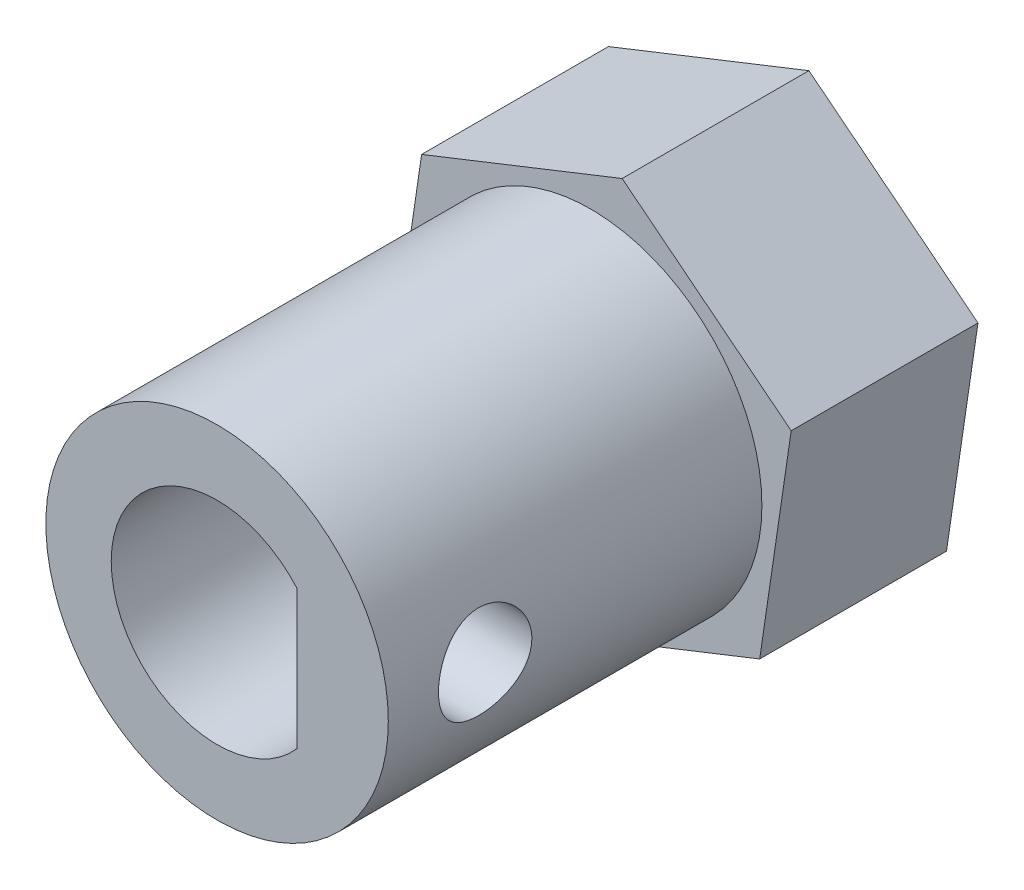
ISO-10303-21;
HEADER;
FILE_DESCRIPTION(('STEP AP214'),'2;1');
FILE_NAME('part.step','',(''),(''),'','','');
FILE_SCHEMA(('AUTOMOTIVE_DESIGN { 1 0 10303 214 1 1 1 1 }'));
ENDSEC;
DATA;
#1=APPLICATION_CONTEXT('core data for automotive mechanical design processes');
#2=APPLICATION_PROTOCOL_DEFINITION('international standard','automotive_design',2000,#1);
#3=PRODUCT_CONTEXT('',#1,'mechanical');
#4=PRODUCT('Part','Part','',(#3));
#5=PRODUCT_RELATED_PRODUCT_CATEGORY('part','',(#4));
#6=PRODUCT_DEFINITION_FORMATION('','',#4);
#7=PRODUCT_DEFINITION_CONTEXT('part definition',#1,'design');
#8=PRODUCT_DEFINITION('design','',#6,#7);
#9=PRODUCT_DEFINITION_SHAPE('','',#8);
#10=(LENGTH_UNIT() NAMED_UNIT(*) SI_UNIT(.MILLI.,.METRE.));
#11=(NAMED_UNIT(*) PLANE_ANGLE_UNIT() SI_UNIT($,.RADIAN.));
#12=(NAMED_UNIT(*) SI_UNIT($,.STERADIAN.) SOLID_ANGLE_UNIT());
#13=UNCERTAINTY_MEASURE_WITH_UNIT(LENGTH_MEASURE(1.E-05),#10,'distance_accuracy_value','');
#14=(GEOMETRIC_REPRESENTATION_CONTEXT(3) GLOBAL_UNCERTAINTY_ASSIGNED_CONTEXT((#13)) GLOBAL_UNIT_ASSIGNED_CONTEXT((#10,
#11,#12)) REPRESENTATION_CONTEXT('',''));
#15=CARTESIAN_POINT('',(0.,0.,0.));
#16=DIRECTION('',(0.,0.,1.));
#17=DIRECTION('',(1.,0.,0.));
#18=AXIS2_PLACEMENT_3D('',#15,#16,#17);
#19=CARTESIAN_POINT('',(-1.01152953573782,-6.8539629411261,6.));
#20=DIRECTION('',(-0.368200976667132,0.9297462238597,0.));
#21=DIRECTION('',(-0.9297462238597,-0.368200976667132,0.));
#22=AXIS2_PLACEMENT_3D('',#19,#20,#21);
#23=PLANE('',#22);
#24=DIRECTION('',(0.9297462238597,0.368200976667132,0.));
#25=VECTOR('',#24,1.);
#26=CARTESIAN_POINT('',(-1.01152953573782,-6.8539629411261,0.));
#27=LINE('',#26,#25);
#28=CARTESIAN_POINT('',(-1.01152953573782,-6.8539629411261,0.));
#29=VERTEX_POINT('',#28);
#30=CARTESIAN_POINT('',(5.4299412557434,-4.30299174519029,0.));
#31=VERTEX_POINT('',#30);
#32=EDGE_CURVE('E132',#29,#31,#27,.T.);
#33=ORIENTED_EDGE('',*,*,#32,.T.);
#34=DIRECTION('',(0.,0.,-1.));
#35=VECTOR('',#34,1.);
#36=CARTESIAN_POINT('',(5.4299412557434,-4.30299174519029,6.));
#37=LINE('',#36,#35);
#38=CARTESIAN_POINT('',(5.4299412557434,-4.30299174519029,6.));
#39=VERTEX_POINT('',#38);
#40=EDGE_CURVE('E11',#39,#31,#37,.T.);
#41=ORIENTED_EDGE('',*,*,#40,.F.);
#42=DIRECTION('',(0.9297462238597,0.368200976667132,0.));
#43=VECTOR('',#42,1.);
#44=CARTESIAN_POINT('',(-1.01152953573782,-6.8539629411261,6.));
#45=LINE('',#44,#43);
#46=CARTESIAN_POINT('',(-1.01152953573782,-6.8539629411261,6.));
#47=VERTEX_POINT('',#46);
#48=EDGE_CURVE('E144',#47,#39,#45,.T.);
#49=ORIENTED_EDGE('',*,*,#48,.F.);
#50=DIRECTION('',(0.,0.,-1.));
#51=VECTOR('',#50,1.);
#52=CARTESIAN_POINT('',(-1.01152953573782,-6.8539629411261,6.));
#53=LINE('',#52,#51);
#54=EDGE_CURVE('E128',#47,#29,#53,.T.);
#55=ORIENTED_EDGE('',*,*,#54,.T.);
#56=EDGE_LOOP('',(#33,#41,#49,#55));
#57=FACE_BOUND('',#56,.T.);
#58=ADVANCED_FACE('F36',(#57),#23,.F.);
#59=CARTESIAN_POINT('',(5.4299412557434,-4.30299174519029,6.));
#60=DIRECTION('',(-0.989284337268719,0.146001712437872,0.));
#61=DIRECTION('',(-0.146001712437872,-0.989284337268719,0.));
#62=AXIS2_PLACEMENT_3D('',#59,#60,#61);
#63=PLANE('',#62);
#64=DIRECTION('',(0.146001712437872,0.989284337268719,0.));
#65=VECTOR('',#64,1.);
#66=CARTESIAN_POINT('',(5.4299412557434,-4.30299174519029,0.));
#67=LINE('',#66,#65);
#68=CARTESIAN_POINT('',(6.44147079148123,2.55097119593582,0.));
#69=VERTEX_POINT('',#68);
#70=EDGE_CURVE('E135',#31,#69,#67,.T.);
#71=ORIENTED_EDGE('',*,*,#70,.T.);
#72=DIRECTION('',(0.,0.,-1.));
#73=VECTOR('',#72,1.);
#74=CARTESIAN_POINT('',(6.44147079148123,2.55097119593582,6.));
#75=LINE('',#74,#73);
#76=CARTESIAN_POINT('',(6.44147079148123,2.55097119593582,6.));
#77=VERTEX_POINT('',#76);
#78=EDGE_CURVE('E44',#77,#69,#75,.T.);
#79=ORIENTED_EDGE('',*,*,#78,.F.);
#80=DIRECTION('',(0.146001712437872,0.989284337268719,0.));
#81=VECTOR('',#80,1.);
#82=CARTESIAN_POINT('',(5.4299412557434,-4.30299174519029,6.));
#83=LINE('',#82,#81);
#84=EDGE_CURVE('E95',#39,#77,#83,.T.);
#85=ORIENTED_EDGE('',*,*,#84,.F.);
#86=ORIENTED_EDGE('',*,*,#40,.T.);
#87=EDGE_LOOP('',(#71,#79,#85,#86));
#88=FACE_BOUND('',#87,.T.);
#89=ADVANCED_FACE('F212',(#88),#63,.F.);
#90=CARTESIAN_POINT('',(6.44147079148123,2.55097119593582,6.));
#91=DIRECTION('',(-0.621083360601587,-0.783744511421827,0.));
#92=DIRECTION('',(0.783744511421827,-0.621083360601587,0.));
#93=AXIS2_PLACEMENT_3D('',#90,#91,#92);
#94=PLANE('',#93);
#95=DIRECTION('',(-0.783744511421827,0.621083360601587,0.));
#96=VECTOR('',#95,1.);
#97=CARTESIAN_POINT('',(6.44147079148123,2.55097119593582,0.));
#98=LINE('',#97,#96);
#99=CARTESIAN_POINT('',(1.01152953573782,6.8539629411261,0.));
#100=VERTEX_POINT('',#99);
#101=EDGE_CURVE('E138',#69,#100,#98,.T.);
#102=ORIENTED_EDGE('',*,*,#101,.T.);
#103=DIRECTION('',(0.,0.,-1.));
#104=VECTOR('',#103,1.);
#105=CARTESIAN_POINT('',(1.01152953573782,6.8539629411261,6.));
#106=LINE('',#105,#104);
#107=CARTESIAN_POINT('',(1.01152953573782,6.8539629411261,6.));
#108=VERTEX_POINT('',#107);
#109=EDGE_CURVE('E123',#108,#100,#106,.T.);
#110=ORIENTED_EDGE('',*,*,#109,.F.);
#111=DIRECTION('',(-0.783744511421827,0.621083360601587,0.));
#112=VECTOR('',#111,1.);
#113=CARTESIAN_POINT('',(6.44147079148123,2.55097119593582,6.));
#114=LINE('',#113,#112);
#115=EDGE_CURVE('E111',#77,#108,#114,.T.);
#116=ORIENTED_EDGE('',*,*,#115,.F.);
#117=ORIENTED_EDGE('',*,*,#78,.T.);
#118=EDGE_LOOP('',(#102,#110,#116,#117));
#119=FACE_BOUND('',#118,.T.);
#120=ADVANCED_FACE('F151',(#119),#94,.F.);
#121=CARTESIAN_POINT('',(1.01152953573782,6.8539629411261,6.));
#122=DIRECTION('',(0.368200976667131,-0.9297462238597,0.));
#123=DIRECTION('',(0.9297462238597,0.368200976667131,0.));
#124=AXIS2_PLACEMENT_3D('',#121,#122,#123);
#125=PLANE('',#124);
#126=DIRECTION('',(-0.9297462238597,-0.368200976667131,0.));
#127=VECTOR('',#126,1.);
#128=CARTESIAN_POINT('',(1.01152953573782,6.8539629411261,0.));
#129=LINE('',#128,#127);
#130=CARTESIAN_POINT('',(-5.4299412557434,4.30299174519029,0.));
#131=VERTEX_POINT('',#130);
#132=EDGE_CURVE('E120',#100,#131,#129,.T.);
#133=ORIENTED_EDGE('',*,*,#132,.T.);
#134=DIRECTION('',(0.,0.,-1.));
#135=VECTOR('',#134,1.);
#136=CARTESIAN_POINT('',(-5.4299412557434,4.30299174519029,6.));
#137=LINE('',#136,#135);
#138=CARTESIAN_POINT('',(-5.4299412557434,4.30299174519029,6.));
#139=VERTEX_POINT('',#138);
#140=EDGE_CURVE('E117',#139,#131,#137,.T.);
#141=ORIENTED_EDGE('',*,*,#140,.F.);
#142=DIRECTION('',(-0.9297462238597,-0.368200976667131,0.));
#143=VECTOR('',#142,1.);
#144=CARTESIAN_POINT('',(1.01152953573782,6.8539629411261,6.));
#145=LINE('',#144,#143);
#146=EDGE_CURVE('E104',#108,#139,#145,.T.);
#147=ORIENTED_EDGE('',*,*,#146,.F.);
#148=ORIENTED_EDGE('',*,*,#109,.T.);
#149=EDGE_LOOP('',(#133,#141,#147,#148));
#150=FACE_BOUND('',#149,.T.);
#151=ADVANCED_FACE('F118',(#150),#125,.F.);
#152=CARTESIAN_POINT('',(-5.4299412557434,4.30299174519029,6.));
#153=DIRECTION('',(0.989284337268719,-0.146001712437873,0.));
#154=DIRECTION('',(0.146001712437873,0.989284337268719,0.));
#155=AXIS2_PLACEMENT_3D('',#152,#153,#154);
#156=PLANE('',#155);
#157=DIRECTION('',(-0.146001712437873,-0.989284337268719,0.));
#158=VECTOR('',#157,1.);
#159=CARTESIAN_POINT('',(-5.4299412557434,4.30299174519029,0.));
#160=LINE('',#159,#158);
#161=CARTESIAN_POINT('',(-6.44147079148122,-2.55097119593582,0.));
#162=VERTEX_POINT('',#161);
#163=EDGE_CURVE('E141',#131,#162,#160,.T.);
#164=ORIENTED_EDGE('',*,*,#163,.T.);
#165=DIRECTION('',(0.,0.,-1.));
#166=VECTOR('',#165,1.);
#167=CARTESIAN_POINT('',(-6.44147079148122,-2.55097119593582,6.));
#168=LINE('',#167,#166);
#169=CARTESIAN_POINT('',(-6.44147079148122,-2.55097119593582,6.));
#170=VERTEX_POINT('',#169);
#171=EDGE_CURVE('E124',#170,#162,#168,.T.);
#172=ORIENTED_EDGE('',*,*,#171,.F.);
#173=DIRECTION('',(-0.146001712437873,-0.989284337268719,0.));
#174=VECTOR('',#173,1.);
#175=CARTESIAN_POINT('',(-5.4299412557434,4.30299174519029,6.));
#176=LINE('',#175,#174);
#177=EDGE_CURVE('E108',#139,#170,#176,.T.);
#178=ORIENTED_EDGE('',*,*,#177,.F.);
#179=ORIENTED_EDGE('',*,*,#140,.T.);
#180=EDGE_LOOP('',(#164,#172,#178,#179));
#181=FACE_BOUND('',#180,.T.);
#182=ADVANCED_FACE('F126',(#181),#156,.F.);
#183=CARTESIAN_POINT('',(-6.44147079148122,-2.55097119593582,6.));
#184=DIRECTION('',(0.621083360601588,0.783744511421827,0.));
#185=DIRECTION('',(-0.783744511421827,0.621083360601588,0.));
#186=AXIS2_PLACEMENT_3D('',#183,#184,#185);
#187=PLANE('',#186);
#188=DIRECTION('',(0.783744511421827,-0.621083360601588,0.));
#189=VECTOR('',#188,1.);
#190=CARTESIAN_POINT('',(-6.44147079148122,-2.55097119593582,0.));
#191=LINE('',#190,#189);
#192=EDGE_CURVE('E87',#162,#29,#191,.T.);
#193=ORIENTED_EDGE('',*,*,#192,.T.);
#194=ORIENTED_EDGE('',*,*,#54,.F.);
#195=DIRECTION('',(0.783744511421827,-0.621083360601588,0.));
#196=VECTOR('',#195,1.);
#197=CARTESIAN_POINT('',(-6.44147079148122,-2.55097119593582,6.));
#198=LINE('',#197,#196);
#199=EDGE_CURVE('E60',#170,#47,#198,.T.);
#200=ORIENTED_EDGE('',*,*,#199,.F.);
#201=ORIENTED_EDGE('',*,*,#171,.T.);
#202=EDGE_LOOP('',(#193,#194,#200,#201));
#203=FACE_BOUND('',#202,.T.);
#204=ADVANCED_FACE('F155',(#203),#187,.F.);
#205=CARTESIAN_POINT('',(0.,0.,6.));
#206=DIRECTION('',(0.,0.,1.));
#207=DIRECTION('',(1.,0.,0.));
#208=AXIS2_PLACEMENT_3D('',#205,#206,#207);
#209=PLANE('',#208);
#210=CARTESIAN_POINT('',(0.,0.,6.));
#211=DIRECTION('',(0.,0.,1.));
#212=DIRECTION('',(1.,0.,0.));
#213=AXIS2_PLACEMENT_3D('',#210,#211,#212);
#214=CIRCLE('',#213,5.5);
#215=CARTESIAN_POINT('',(5.5,0.,6.));
#216=VERTEX_POINT('',#215);
#217=EDGE_CURVE('E162',#216,#216,#214,.T.);
#218=ORIENTED_EDGE('',*,*,#217,.F.);
#219=EDGE_LOOP('',(#218));
#220=FACE_BOUND('',#219,.T.);
#221=ORIENTED_EDGE('',*,*,#48,.T.);
#222=ORIENTED_EDGE('',*,*,#84,.T.);
#223=ORIENTED_EDGE('',*,*,#115,.T.);
#224=ORIENTED_EDGE('',*,*,#146,.T.);
#225=ORIENTED_EDGE('',*,*,#177,.T.);
#226=ORIENTED_EDGE('',*,*,#199,.T.);
#227=EDGE_LOOP('',(#221,#222,#223,#224,#225,#226));
#228=FACE_BOUND('',#227,.T.);
#229=ADVANCED_FACE('F106',(#220,#228),#209,.T.);
#230=CARTESIAN_POINT('',(0.,0.,0.));
#231=DIRECTION('',(0.,0.,1.));
#232=DIRECTION('',(1.,0.,0.));
#233=AXIS2_PLACEMENT_3D('',#230,#231,#232);
#234=PLANE('',#233);
#235=CARTESIAN_POINT('',(0.,0.,0.));
#236=DIRECTION('',(0.,0.,-1.));
#237=DIRECTION('',(-1.,0.,0.));
#238=AXIS2_PLACEMENT_3D('',#235,#236,#237);
#239=CIRCLE('',#238,1.6);
#240=CARTESIAN_POINT('',(-1.6,0.,0.));
#241=VERTEX_POINT('',#240);
#242=EDGE_CURVE('E165',#241,#241,#239,.T.);
#243=ORIENTED_EDGE('',*,*,#242,.F.);
#244=EDGE_LOOP('',(#243));
#245=FACE_BOUND('',#244,.T.);
#246=ORIENTED_EDGE('',*,*,#32,.F.);
#247=ORIENTED_EDGE('',*,*,#192,.F.);
#248=ORIENTED_EDGE('',*,*,#163,.F.);
#249=ORIENTED_EDGE('',*,*,#132,.F.);
#250=ORIENTED_EDGE('',*,*,#101,.F.);
#251=ORIENTED_EDGE('',*,*,#70,.F.);
#252=EDGE_LOOP('',(#246,#247,#248,#249,#250,#251));
#253=FACE_BOUND('',#252,.T.);
#254=ADVANCED_FACE('F154',(#245,#253),#234,.F.);
#255=CARTESIAN_POINT('',(0.,0.,18.));
#256=DIRECTION('',(0.,0.,-1.));
#257=DIRECTION('',(-1.,0.,0.));
#258=AXIS2_PLACEMENT_3D('',#255,#256,#257);
#259=CYLINDRICAL_SURFACE('',#258,5.5);
#260=CARTESIAN_POINT('',(5.29150262212918,-1.5,14.8880161135564));
#261=CARTESIAN_POINT('',(5.29150397933242,-1.4999981569703,14.9705725645842));
#262=CARTESIAN_POINT('',(5.29345578048323,-1.49316121586719,15.0531482235119));
#263=CARTESIAN_POINT('',(5.3010274190552,-1.46604910592423,15.2159096388564));
#264=CARTESIAN_POINT('',(5.30664898703923,-1.44576759691971,15.296094249055));
#265=CARTESIAN_POINT('',(5.32087717395131,-1.39248674622751,15.4516953015183));
#266=CARTESIAN_POINT('',(5.32947946238205,-1.35950584697685,15.5271184744606));
#267=CARTESIAN_POINT('',(5.34869425130277,-1.28182074023251,15.6713742477931));
#268=CARTESIAN_POINT('',(5.35930693404948,-1.23711546969878,15.7402062497937));
#269=CARTESIAN_POINT('',(5.38165786345274,-1.13599985857016,15.8711263203478));
#270=CARTESIAN_POINT('',(5.39341679089298,-1.07933774218464,15.9330164419345));
#271=CARTESIAN_POINT('',(5.41655710292429,-0.956458027204655,16.0465437712819));
#272=CARTESIAN_POINT('',(5.4279384467319,-0.890239400501257,16.0981798744724));
#273=CARTESIAN_POINT('',(5.44927272086847,-0.748747592415014,16.1905647403669));
#274=CARTESIAN_POINT('',(5.45919841481043,-0.6733408831181,16.2311158353829));
#275=CARTESIAN_POINT('',(5.4762652255866,-0.516463712056493,16.2988889817393));
#276=CARTESIAN_POINT('',(5.48340683437022,-0.434994324603005,16.3261133881306));
#277=CARTESIAN_POINT('',(5.49395456075485,-0.270371451848027,16.3658172118369));
#278=CARTESIAN_POINT('',(5.4974458959785,-0.187304783419296,16.3786335577711));
#279=CARTESIAN_POINT('',(5.50059802264474,-0.0201318714747532,16.3902184158544));
#280=CARTESIAN_POINT('',(5.50025948354,0.0639741877907251,16.3889893831009));
#281=CARTESIAN_POINT('',(5.49585206403333,0.228490060702581,16.372753714908));
#282=CARTESIAN_POINT('',(5.49188178563756,0.308938859429582,16.3581112402372));
#283=CARTESIAN_POINT('',(5.48077394096948,0.466191004896708,16.3160537812108));
#284=CARTESIAN_POINT('',(5.47363619004791,0.542994138822172,16.2886380522281));
#285=CARTESIAN_POINT('',(5.45685088879515,0.691693236894892,16.2215389777134));
#286=CARTESIAN_POINT('',(5.44717834180867,0.76353077549158,16.1817326648687));
#287=CARTESIAN_POINT('',(5.4263628785745,0.899629268660997,16.091077219289));
#288=CARTESIAN_POINT('',(5.41521966459728,0.963888684077532,16.0402258491851));
#289=CARTESIAN_POINT('',(5.39224620796906,1.08518074875882,15.9269981184356));
#290=CARTESIAN_POINT('',(5.38040539296798,1.14191553261874,15.8643044416156));
#291=CARTESIAN_POINT('',(5.35769198772825,1.24414076282169,15.7301708984431));
#292=CARTESIAN_POINT('',(5.34681946230361,1.28963045681795,15.65873044737));
#293=CARTESIAN_POINT('',(5.32722971617593,1.36831504906637,15.5084617195561));
#294=CARTESIAN_POINT('',(5.31852743967169,1.40142544272701,15.4295871077822));
#295=CARTESIAN_POINT('',(5.30444735453973,1.45381649809064,15.2670935113273));
#296=CARTESIAN_POINT('',(5.29906867769277,1.47310077178258,15.1834757719236));
#297=CARTESIAN_POINT('',(5.29243075183376,1.49677126460125,15.0166639320464));
#298=CARTESIAN_POINT('',(5.29104827888985,1.50160329063472,14.9335379267923));
#299=CARTESIAN_POINT('',(5.29222151202243,1.49746332611022,14.7676649700143));
#300=CARTESIAN_POINT('',(5.29477677694071,1.48849288189024,14.6849179770701));
#301=CARTESIAN_POINT('',(5.30341820279288,1.45739637961775,14.523893676245));
#302=CARTESIAN_POINT('',(5.3094315020934,1.43554156609381,14.4455596929266));
#303=CARTESIAN_POINT('',(5.32423951436502,1.37960331838531,14.2936701036258));
#304=CARTESIAN_POINT('',(5.33303460273288,1.34551823366713,14.2201151441787));
#305=CARTESIAN_POINT('',(5.3526656797527,1.26519240779034,14.0780154053894));
#306=CARTESIAN_POINT('',(5.36354371589181,1.21869167395158,14.0096235390514));
#307=CARTESIAN_POINT('',(5.3860176273416,1.11517441622706,13.8814500481713));
#308=CARTESIAN_POINT('',(5.39761364372337,1.05815582137422,13.8216701234563));
#309=CARTESIAN_POINT('',(5.42064365021152,0.933153363001186,13.7105497496058));
#310=CARTESIAN_POINT('',(5.43206199790196,0.864888847519599,13.6595211101222));
#311=CARTESIAN_POINT('',(5.45308956662174,0.720505557506885,13.5696454784654));
#312=CARTESIAN_POINT('',(5.46269888388575,0.644387201108796,13.5307978382286));
#313=CARTESIAN_POINT('',(5.47896373225224,0.48699233815191,13.4667490472985));
#314=CARTESIAN_POINT('',(5.48564141597945,0.405760013245425,13.4414452232559));
#315=CARTESIAN_POINT('',(5.49538823820121,0.23998586472282,13.4049091610113));
#316=CARTESIAN_POINT('',(5.4984582160406,0.155444815623818,13.3936736497295));
#317=CARTESIAN_POINT('',(5.50060207356917,-0.0116397196820221,13.3858059934658));
#318=CARTESIAN_POINT('',(5.49980084994582,-0.0941604093051909,13.3887174422497));
#319=CARTESIAN_POINT('',(5.4945768528746,-0.257491304637165,13.4079958908664));
#320=CARTESIAN_POINT('',(5.49015422670854,-0.338301579771117,13.4243623434867));
#321=CARTESIAN_POINT('',(5.47821112917835,-0.495342033696848,13.4698234838959));
#322=CARTESIAN_POINT('',(5.47071413494114,-0.571602011794991,13.4988218117967));
#323=CARTESIAN_POINT('',(5.45340440920124,-0.718217369622535,13.5686377350915));
#324=CARTESIAN_POINT('',(5.44359134174256,-0.788571890732095,13.609457045363));
#325=CARTESIAN_POINT('',(5.42235787347661,-0.923488675195433,13.7030708418381));
#326=CARTESIAN_POINT('',(5.41090053751388,-0.987837043212876,13.7561651859931));
#327=CARTESIAN_POINT('',(5.38781343748961,-1.10686496193089,13.8722582521066));
#328=CARTESIAN_POINT('',(5.37618362817694,-1.16154192474211,13.9352596165077));
#329=CARTESIAN_POINT('',(5.35375507792812,-1.2609396606189,14.0711436403873));
#330=CARTESIAN_POINT('',(5.34298201162846,-1.30539879787935,14.1442223162372));
#331=CARTESIAN_POINT('',(5.32385655741428,-1.3813380630303,14.297102058706));
#332=CARTESIAN_POINT('',(5.31550265682104,-1.41282630671052,14.3768988840667));
#333=CARTESIAN_POINT('',(5.30326481572331,-1.4580261115212,14.528284132809));
#334=CARTESIAN_POINT('',(5.29889066810921,-1.47372831222932,14.5992445823079));
#335=CARTESIAN_POINT('',(5.29300915582115,-1.494715407894,14.7428039114591));
#336=CARTESIAN_POINT('',(5.29150142838456,-1.5000016210592,14.8154025826077));
#337=CARTESIAN_POINT('',(5.29150262212918,-1.5,14.8880161135564));
#338=B_SPLINE_CURVE_WITH_KNOTS('',3,(#260,#261,#262,#263,#264,#265,#266,#267,#268,#269,#270,
#271,#272,#273,#274,#275,#276,#277,#278,#279,#280,#281,#282,#283,#284,#285,#286,#287,#288,#289,
#290,#291,#292,#293,#294,#295,#296,#297,#298,#299,#300,#301,#302,#303,#304,#305,#306,#307,#308,
#309,#310,#311,#312,#313,#314,#315,#316,#317,#318,#319,#320,#321,#322,#323,#324,#325,#326,#327,
#328,#329,#330,#331,#332,#333,#334,#335,#336,#337),.UNSPECIFIED.,.T.,.F.,(4,2,2,2,2,2,2,2,2,2,2,
2,2,2,2,2,2,2,2,2,2,2,2,2,2,2,2,2,2,2,2,2,2,2,2,2,2,2,4),(0.,0.247402201391967,
0.494921155336742,0.74208200229141,0.989265266888851,1.24229327000826,1.49534851471804,
1.75265882819586,2.00992365416647,2.26103843021061,2.51210931268384,2.75655962385663,
3.0010241872433,3.24799669713118,3.49501928234234,3.74996416866223,4.00492610732058,
4.26159801830625,4.51820285087414,4.76680611540842,5.01538153009582,5.25890187447337,
5.50245509545498,5.75157425489228,6.00074251835821,6.25748556676549,6.51421495339717,
6.76896951768223,7.02366480072505,7.27019876040454,7.51672269408902,7.76139812559489,
8.00610907011738,8.25758505394756,8.50912822664455,8.76653181226182,9.02377409687475,
9.24140725781328,9.45901287413894),.UNSPECIFIED.);
#339=CARTESIAN_POINT('',(5.29150262212918,-1.5,14.8880161135564));
#340=VERTEX_POINT('',#339);
#341=EDGE_CURVE('E173',#340,#340,#338,.T.);
#342=ORIENTED_EDGE('',*,*,#341,.T.);
#343=EDGE_LOOP('',(#342));
#344=FACE_BOUND('',#343,.T.);
#345=CARTESIAN_POINT('',(0.,0.,18.));
#346=DIRECTION('',(0.,0.,1.));
#347=DIRECTION('',(1.,0.,0.));
#348=AXIS2_PLACEMENT_3D('',#345,#346,#347);
#349=CIRCLE('',#348,5.5);
#350=CARTESIAN_POINT('',(5.5,0.,18.));
#351=VERTEX_POINT('',#350);
#352=EDGE_CURVE('E136',#351,#351,#349,.T.);
#353=ORIENTED_EDGE('',*,*,#352,.F.);
#354=EDGE_LOOP('',(#353));
#355=FACE_BOUND('',#354,.T.);
#356=ORIENTED_EDGE('',*,*,#217,.T.);
#357=EDGE_LOOP('',(#356));
#358=FACE_BOUND('',#357,.T.);
#359=ADVANCED_FACE('F182',(#344,#355,#358),#259,.T.);
#360=CARTESIAN_POINT('',(0.,0.,18.));
#361=DIRECTION('',(0.,0.,1.));
#362=DIRECTION('',(1.,0.,0.));
#363=AXIS2_PLACEMENT_3D('',#360,#361,#362);
#364=PLANE('',#363);
#365=CARTESIAN_POINT('',(0.,0.,18.));
#366=DIRECTION('',(0.,0.,1.));
#367=DIRECTION('',(1.,0.,0.));
#368=AXIS2_PLACEMENT_3D('',#365,#366,#367);
#369=CIRCLE('',#368,3.4);
#370=CARTESIAN_POINT('',(2.56914654537586,2.22699035210826,18.));
#371=VERTEX_POINT('',#370);
#372=CARTESIAN_POINT('',(2.56914654537586,-2.22699035210826,18.));
#373=VERTEX_POINT('',#372);
#374=EDGE_CURVE('E51',#371,#373,#369,.T.);
#375=ORIENTED_EDGE('',*,*,#374,.F.);
#376=DIRECTION('',(0.,1.,0.));
#377=VECTOR('',#376,1.);
#378=CARTESIAN_POINT('',(2.56914654537586,2.22699035210826,18.));
#379=LINE('',#378,#377);
#380=EDGE_CURVE('E303',#373,#371,#379,.T.);
#381=ORIENTED_EDGE('',*,*,#380,.F.);
#382=EDGE_LOOP('',(#375,#381));
#383=FACE_BOUND('',#382,.T.);
#384=ORIENTED_EDGE('',*,*,#352,.T.);
#385=EDGE_LOOP('',(#384));
#386=FACE_BOUND('',#385,.T.);
#387=ADVANCED_FACE('F201',(#383,#386),#364,.T.);
#388=CARTESIAN_POINT('',(0.,0.,6.));
#389=DIRECTION('',(0.,0.,-1.));
#390=DIRECTION('',(-1.,0.,0.));
#391=AXIS2_PLACEMENT_3D('',#388,#389,#390);
#392=CYLINDRICAL_SURFACE('',#391,1.6);
#393=CARTESIAN_POINT('',(0.,0.,6.));
#394=DIRECTION('',(0.,0.,1.));
#395=DIRECTION('',(1.,0.,0.));
#396=AXIS2_PLACEMENT_3D('',#393,#394,#395);
#397=CIRCLE('',#396,1.6);
#398=CARTESIAN_POINT('',(1.6,0.,6.));
#399=VERTEX_POINT('',#398);
#400=EDGE_CURVE('E170',#399,#399,#397,.F.);
#401=ORIENTED_EDGE('',*,*,#400,.F.);
#402=EDGE_LOOP('',(#401));
#403=FACE_BOUND('',#402,.T.);
#404=ORIENTED_EDGE('',*,*,#242,.T.);
#405=EDGE_LOOP('',(#404));
#406=FACE_BOUND('',#405,.T.);
#407=ADVANCED_FACE('F198',(#403,#406),#392,.F.);
#408=CARTESIAN_POINT('',(0.,0.,6.));
#409=DIRECTION('',(0.,0.,1.));
#410=DIRECTION('',(1.,0.,0.));
#411=AXIS2_PLACEMENT_3D('',#408,#409,#410);
#412=PLANE('',#411);
#413=ORIENTED_EDGE('',*,*,#400,.T.);
#414=EDGE_LOOP('',(#413));
#415=FACE_BOUND('',#414,.T.);
#416=CARTESIAN_POINT('',(0.,0.,6.));
#417=DIRECTION('',(0.,0.,1.));
#418=DIRECTION('',(1.,0.,0.));
#419=AXIS2_PLACEMENT_3D('',#416,#417,#418);
#420=CIRCLE('',#419,3.4);
#421=CARTESIAN_POINT('',(2.56914654537586,-2.22699035210826,6.));
#422=VERTEX_POINT('',#421);
#423=CARTESIAN_POINT('',(2.56914654537586,2.22699035210826,6.));
#424=VERTEX_POINT('',#423);
#425=EDGE_CURVE('E291',#422,#424,#420,.F.);
#426=ORIENTED_EDGE('',*,*,#425,.F.);
#427=DIRECTION('',(0.,-1.,0.));
#428=VECTOR('',#427,1.);
#429=CARTESIAN_POINT('',(2.56914654537586,2.22699035210826,6.));
#430=LINE('',#429,#428);
#431=EDGE_CURVE('E180',#424,#422,#430,.T.);
#432=ORIENTED_EDGE('',*,*,#431,.F.);
#433=EDGE_LOOP('',(#426,#432));
#434=FACE_BOUND('',#433,.T.);
#435=ADVANCED_FACE('F192',(#415,#434),#412,.T.);
#436=CARTESIAN_POINT('',(12.45,0.,14.8880161135564));
#437=DIRECTION('',(-1.,0.,0.));
#438=DIRECTION('',(0.,-1.,0.));
#439=AXIS2_PLACEMENT_3D('',#436,#437,#438);
#440=CYLINDRICAL_SURFACE('',#439,1.5);
#441=CARTESIAN_POINT('',(2.56914654537586,0.,14.8880161135564));
#442=DIRECTION('',(1.,0.,0.));
#443=DIRECTION('',(0.,0.,-1.));
#444=AXIS2_PLACEMENT_3D('',#441,#442,#443);
#445=CIRCLE('',#444,1.5);
#446=CARTESIAN_POINT('',(2.56914654537586,0.,13.3880161135564));
#447=VERTEX_POINT('',#446);
#448=EDGE_CURVE('E39',#447,#447,#445,.F.);
#449=ORIENTED_EDGE('',*,*,#448,.T.);
#450=EDGE_LOOP('',(#449));
#451=FACE_BOUND('',#450,.T.);
#452=ORIENTED_EDGE('',*,*,#341,.F.);
#453=EDGE_LOOP('',(#452));
#454=FACE_BOUND('',#453,.T.);
#455=ADVANCED_FACE('F186',(#451,#454),#440,.F.);
#456=CARTESIAN_POINT('',(2.56914654537586,2.22699035210826,-3.04824350248006));
#457=DIRECTION('',(1.,0.,0.));
#458=DIRECTION('',(0.,0.,-1.));
#459=AXIS2_PLACEMENT_3D('',#456,#457,#458);
#460=PLANE('',#459);
#461=ORIENTED_EDGE('',*,*,#431,.T.);
#462=DIRECTION('',(0.,0.,1.));
#463=VECTOR('',#462,1.);
#464=CARTESIAN_POINT('',(2.56914654537586,-2.22699035210826,-3.04824350248006));
#465=LINE('',#464,#463);
#466=EDGE_CURVE('E296',#422,#373,#465,.T.);
#467=ORIENTED_EDGE('',*,*,#466,.T.);
#468=ORIENTED_EDGE('',*,*,#380,.T.);
#469=DIRECTION('',(0.,0.,1.));
#470=VECTOR('',#469,1.);
#471=CARTESIAN_POINT('',(2.56914654537586,2.22699035210826,-3.04824350248006));
#472=LINE('',#471,#470);
#473=EDGE_CURVE('E294',#424,#371,#472,.T.);
#474=ORIENTED_EDGE('',*,*,#473,.F.);
#475=EDGE_LOOP('',(#461,#467,#468,#474));
#476=FACE_BOUND('',#475,.T.);
#477=ORIENTED_EDGE('',*,*,#448,.F.);
#478=EDGE_LOOP('',(#477));
#479=FACE_BOUND('',#478,.T.);
#480=ADVANCED_FACE('F191',(#476,#479),#460,.F.);
#481=CARTESIAN_POINT('',(0.,0.,-3.04824350248006));
#482=DIRECTION('',(0.,0.,1.));
#483=DIRECTION('',(1.,0.,0.));
#484=AXIS2_PLACEMENT_3D('',#481,#482,#483);
#485=CYLINDRICAL_SURFACE('',#484,3.4);
#486=ORIENTED_EDGE('',*,*,#425,.T.);
#487=ORIENTED_EDGE('',*,*,#473,.T.);
#488=ORIENTED_EDGE('',*,*,#374,.T.);
#489=ORIENTED_EDGE('',*,*,#466,.F.);
#490=EDGE_LOOP('',(#486,#487,#488,#489));
#491=FACE_BOUND('',#490,.T.);
#492=ADVANCED_FACE('F194',(#491),#485,.F.);
#493=CLOSED_SHELL('',(#58,#89,#120,#151,#182,#204,#229,#254,#359,#387,#407,#435,#455,#480,#492));
#494=MANIFOLD_SOLID_BREP('B2',#493);
#495=ADVANCED_BREP_SHAPE_REPRESENTATION('',(#18,#494),#14);
#496=SHAPE_DEFINITION_REPRESENTATION(#9,#495);
ENDSEC;
END-ISO-10303-21;
